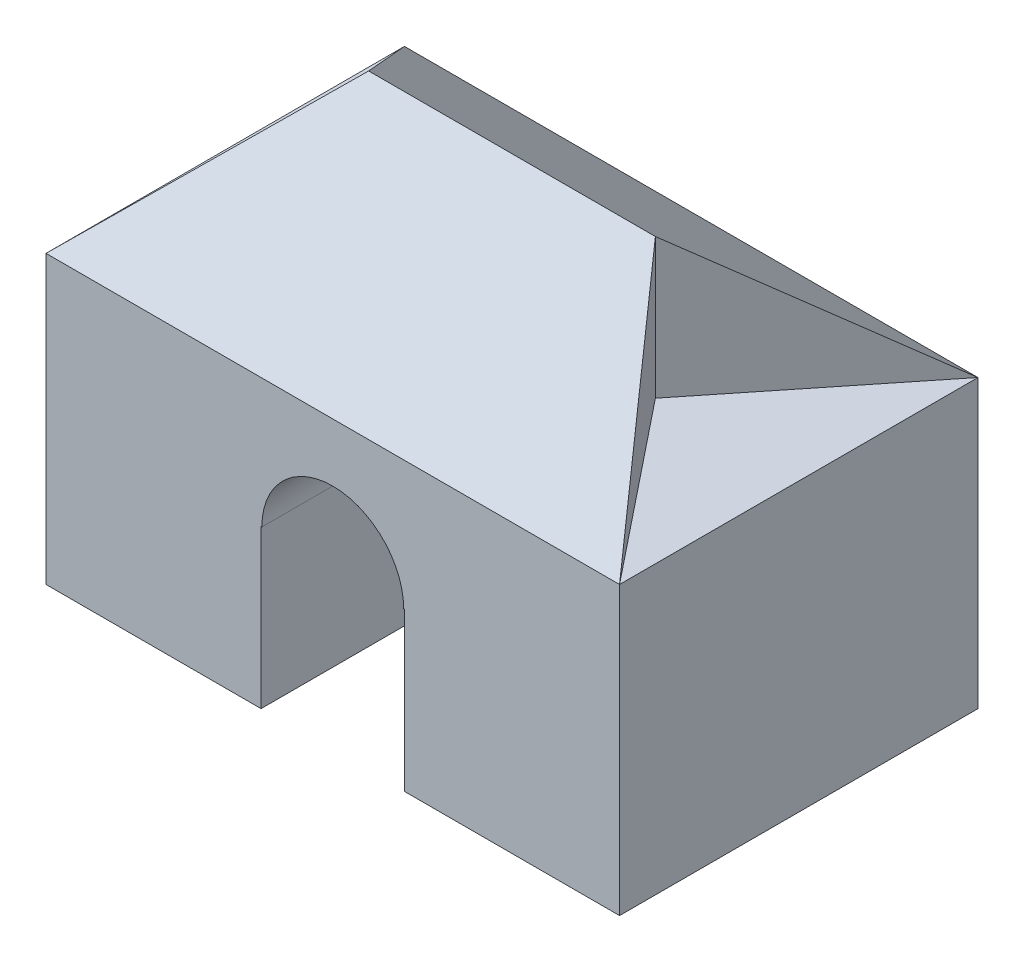
ISO-10303-21;
HEADER;
FILE_DESCRIPTION(('STEP AP214'),'2;1');
FILE_NAME('part.step','',(''),(''),'','','');
FILE_SCHEMA(('AUTOMOTIVE_DESIGN { 1 0 10303 214 1 1 1 1 }'));
ENDSEC;
DATA;
#1=APPLICATION_CONTEXT('core data for automotive mechanical design processes');
#2=APPLICATION_PROTOCOL_DEFINITION('international standard','automotive_design',2000,#1);
#3=PRODUCT_CONTEXT('',#1,'mechanical');
#4=PRODUCT('Part','Part','',(#3));
#5=PRODUCT_RELATED_PRODUCT_CATEGORY('part','',(#4));
#6=PRODUCT_DEFINITION_FORMATION('','',#4);
#7=PRODUCT_DEFINITION_CONTEXT('part definition',#1,'design');
#8=PRODUCT_DEFINITION('design','',#6,#7);
#9=PRODUCT_DEFINITION_SHAPE('','',#8);
#10=(LENGTH_UNIT() NAMED_UNIT(*) SI_UNIT(.MILLI.,.METRE.));
#11=(NAMED_UNIT(*) PLANE_ANGLE_UNIT() SI_UNIT($,.RADIAN.));
#12=(NAMED_UNIT(*) SI_UNIT($,.STERADIAN.) SOLID_ANGLE_UNIT());
#13=UNCERTAINTY_MEASURE_WITH_UNIT(LENGTH_MEASURE(1.E-05),#10,'distance_accuracy_value','');
#14=(GEOMETRIC_REPRESENTATION_CONTEXT(3) GLOBAL_UNCERTAINTY_ASSIGNED_CONTEXT((#13)) GLOBAL_UNIT_ASSIGNED_CONTEXT((#10,
#11,#12)) REPRESENTATION_CONTEXT('',''));
#15=CARTESIAN_POINT('',(0.,0.,0.));
#16=DIRECTION('',(0.,0.,1.));
#17=DIRECTION('',(1.,0.,0.));
#18=AXIS2_PLACEMENT_3D('',#15,#16,#17);
#19=CARTESIAN_POINT('',(0.,200.,0.));
#20=DIRECTION('',(0.,1.,0.));
#21=DIRECTION('',(0.,0.,1.));
#22=AXIS2_PLACEMENT_3D('',#19,#20,#21);
#23=PLANE('',#22);
#24=DIRECTION('',(0.,0.,-1.));
#25=VECTOR('',#24,1.);
#26=CARTESIAN_POINT('',(200.,200.,-125.));
#27=LINE('',#26,#25);
#28=CARTESIAN_POINT('',(200.,200.,125.));
#29=VERTEX_POINT('',#28);
#30=CARTESIAN_POINT('',(200.,200.,-125.));
#31=VERTEX_POINT('',#30);
#32=EDGE_CURVE('E156',#29,#31,#27,.T.);
#33=ORIENTED_EDGE('',*,*,#32,.T.);
#34=DIRECTION('',(-0.624695047554424,0.,0.78086880944303));
#35=VECTOR('',#34,1.);
#36=CARTESIAN_POINT('',(60.9756097560976,200.,48.7804878048781));
#37=LINE('',#36,#35);
#38=CARTESIAN_POINT('',(100.,200.,0.));
#39=VERTEX_POINT('',#38);
#40=EDGE_CURVE('E179',#31,#39,#37,.T.);
#41=ORIENTED_EDGE('',*,*,#40,.T.);
#42=DIRECTION('',(-0.624695047554424,0.,-0.78086880944303));
#43=VECTOR('',#42,1.);
#44=CARTESIAN_POINT('',(60.9756097560976,200.,-48.7804878048781));
#45=LINE('',#44,#43);
#46=EDGE_CURVE('E146',#29,#39,#45,.T.);
#47=ORIENTED_EDGE('',*,*,#46,.F.);
#48=EDGE_LOOP('',(#33,#41,#47));
#49=FACE_BOUND('',#48,.T.);
#50=ADVANCED_FACE('F33',(#49),#23,.T.);
#51=CARTESIAN_POINT('',(200.,200.,-125.));
#52=DIRECTION('',(-1.,0.,0.));
#53=DIRECTION('',(0.,0.,1.));
#54=AXIS2_PLACEMENT_3D('',#51,#52,#53);
#55=PLANE('',#54);
#56=DIRECTION('',(0.,0.,-1.));
#57=VECTOR('',#56,1.);
#58=CARTESIAN_POINT('',(200.,0.,-125.));
#59=LINE('',#58,#57);
#60=CARTESIAN_POINT('',(200.,0.,125.));
#61=VERTEX_POINT('',#60);
#62=CARTESIAN_POINT('',(200.,0.,-125.));
#63=VERTEX_POINT('',#62);
#64=EDGE_CURVE('E192',#61,#63,#59,.T.);
#65=ORIENTED_EDGE('',*,*,#64,.T.);
#66=DIRECTION('',(0.,-1.,0.));
#67=VECTOR('',#66,1.);
#68=CARTESIAN_POINT('',(200.,200.,-125.));
#69=LINE('',#68,#67);
#70=EDGE_CURVE('E174',#31,#63,#69,.T.);
#71=ORIENTED_EDGE('',*,*,#70,.F.);
#72=ORIENTED_EDGE('',*,*,#32,.F.);
#73=DIRECTION('',(0.,-1.,0.));
#74=VECTOR('',#73,1.);
#75=CARTESIAN_POINT('',(200.,200.,125.));
#76=LINE('',#75,#74);
#77=EDGE_CURVE('E131',#29,#61,#76,.T.);
#78=ORIENTED_EDGE('',*,*,#77,.T.);
#79=EDGE_LOOP('',(#65,#71,#72,#78));
#80=FACE_BOUND('',#79,.T.);
#81=ADVANCED_FACE('F190',(#80),#55,.F.);
#82=CARTESIAN_POINT('',(-200.,200.,-125.));
#83=DIRECTION('',(0.,0.,1.));
#84=DIRECTION('',(1.,0.,0.));
#85=AXIS2_PLACEMENT_3D('',#82,#83,#84);
#86=PLANE('',#85);
#87=DIRECTION('',(0.,-1.,0.));
#88=VECTOR('',#87,1.);
#89=CARTESIAN_POINT('',(-200.,200.,-125.));
#90=LINE('',#89,#88);
#91=CARTESIAN_POINT('',(-200.,200.,-125.));
#92=VERTEX_POINT('',#91);
#93=CARTESIAN_POINT('',(-200.,0.,-125.));
#94=VERTEX_POINT('',#93);
#95=EDGE_CURVE('E161',#92,#94,#90,.T.);
#96=ORIENTED_EDGE('',*,*,#95,.F.);
#97=DIRECTION('',(1.,0.,0.));
#98=VECTOR('',#97,1.);
#99=CARTESIAN_POINT('',(200.,200.,-125.));
#100=LINE('',#99,#98);
#101=EDGE_CURVE('E41',#92,#31,#100,.T.);
#102=ORIENTED_EDGE('',*,*,#101,.T.);
#103=ORIENTED_EDGE('',*,*,#70,.T.);
#104=DIRECTION('',(-1.,0.,0.));
#105=VECTOR('',#104,1.);
#106=CARTESIAN_POINT('',(-200.,0.,-125.));
#107=LINE('',#106,#105);
#108=EDGE_CURVE('E200',#63,#94,#107,.T.);
#109=ORIENTED_EDGE('',*,*,#108,.T.);
#110=EDGE_LOOP('',(#96,#102,#103,#109));
#111=FACE_BOUND('',#110,.T.);
#112=ADVANCED_FACE('F172',(#111),#86,.F.);
#113=CARTESIAN_POINT('',(-200.,200.,-125.));
#114=DIRECTION('',(1.,0.,0.));
#115=DIRECTION('',(0.,0.,-1.));
#116=AXIS2_PLACEMENT_3D('',#113,#114,#115);
#117=PLANE('',#116);
#118=DIRECTION('',(0.,0.,1.));
#119=VECTOR('',#118,1.);
#120=CARTESIAN_POINT('',(-200.,0.,-125.));
#121=LINE('',#120,#119);
#122=CARTESIAN_POINT('',(-200.,0.,125.));
#123=VERTEX_POINT('',#122);
#124=EDGE_CURVE('E160',#94,#123,#121,.T.);
#125=ORIENTED_EDGE('',*,*,#124,.T.);
#126=DIRECTION('',(0.,-1.,0.));
#127=VECTOR('',#126,1.);
#128=CARTESIAN_POINT('',(-200.,200.,125.));
#129=LINE('',#128,#127);
#130=CARTESIAN_POINT('',(-200.,200.,125.));
#131=VERTEX_POINT('',#130);
#132=EDGE_CURVE('E128',#131,#123,#129,.T.);
#133=ORIENTED_EDGE('',*,*,#132,.F.);
#134=DIRECTION('',(0.,0.,1.));
#135=VECTOR('',#134,1.);
#136=CARTESIAN_POINT('',(-200.,200.,-125.));
#137=LINE('',#136,#135);
#138=EDGE_CURVE('E150',#92,#131,#137,.T.);
#139=ORIENTED_EDGE('',*,*,#138,.F.);
#140=ORIENTED_EDGE('',*,*,#95,.T.);
#141=EDGE_LOOP('',(#125,#133,#139,#140));
#142=FACE_BOUND('',#141,.T.);
#143=ADVANCED_FACE('F158',(#142),#117,.F.);
#144=CARTESIAN_POINT('',(-200.,200.,125.));
#145=DIRECTION('',(0.,0.,-1.));
#146=DIRECTION('',(-1.,0.,0.));
#147=AXIS2_PLACEMENT_3D('',#144,#145,#146);
#148=PLANE('',#147);
#149=ORIENTED_EDGE('',*,*,#77,.F.);
#150=DIRECTION('',(-1.,0.,0.));
#151=VECTOR('',#150,1.);
#152=CARTESIAN_POINT('',(-200.,200.,125.));
#153=LINE('',#152,#151);
#154=EDGE_CURVE('E123',#29,#131,#153,.T.);
#155=ORIENTED_EDGE('',*,*,#154,.T.);
#156=ORIENTED_EDGE('',*,*,#132,.T.);
#157=DIRECTION('',(1.,0.,0.));
#158=VECTOR('',#157,1.);
#159=CARTESIAN_POINT('',(-200.,0.,125.));
#160=LINE('',#159,#158);
#161=CARTESIAN_POINT('',(-50.,0.,125.));
#162=VERTEX_POINT('',#161);
#163=EDGE_CURVE('E188',#123,#162,#160,.T.);
#164=ORIENTED_EDGE('',*,*,#163,.T.);
#165=DIRECTION('',(0.,-1.,0.));
#166=VECTOR('',#165,1.);
#167=CARTESIAN_POINT('',(-50.,0.,125.));
#168=LINE('',#167,#166);
#169=CARTESIAN_POINT('',(-50.,109.989754523702,125.));
#170=VERTEX_POINT('',#169);
#171=EDGE_CURVE('E221',#170,#162,#168,.T.);
#172=ORIENTED_EDGE('',*,*,#171,.F.);
#173=DIRECTION('',(-1.,0.,0.));
#174=VECTOR('',#173,1.);
#175=CARTESIAN_POINT('',(-50.,109.989754523702,125.));
#176=LINE('',#175,#174);
#177=CARTESIAN_POINT('',(-49.4648033010553,109.989754523702,125.));
#178=VERTEX_POINT('',#177);
#179=EDGE_CURVE('E223',#178,#170,#176,.T.);
#180=ORIENTED_EDGE('',*,*,#179,.F.);
#181=CARTESIAN_POINT('',(0.,109.989754523702,125.));
#182=DIRECTION('',(0.,0.,1.));
#183=DIRECTION('',(1.,0.,0.));
#184=AXIS2_PLACEMENT_3D('',#181,#182,#183);
#185=CIRCLE('',#184,49.4648033010553);
#186=CARTESIAN_POINT('',(49.4648033010553,109.989754523702,125.));
#187=VERTEX_POINT('',#186);
#188=EDGE_CURVE('E226',#187,#178,#185,.T.);
#189=ORIENTED_EDGE('',*,*,#188,.F.);
#190=DIRECTION('',(-1.,0.,0.));
#191=VECTOR('',#190,1.);
#192=CARTESIAN_POINT('',(49.4648033010553,109.989754523702,125.));
#193=LINE('',#192,#191);
#194=CARTESIAN_POINT('',(50.,109.989754523702,125.));
#195=VERTEX_POINT('',#194);
#196=EDGE_CURVE('E229',#195,#187,#193,.T.);
#197=ORIENTED_EDGE('',*,*,#196,.F.);
#198=DIRECTION('',(0.,1.,0.));
#199=VECTOR('',#198,1.);
#200=CARTESIAN_POINT('',(50.,0.,125.));
#201=LINE('',#200,#199);
#202=CARTESIAN_POINT('',(50.,0.,125.));
#203=VERTEX_POINT('',#202);
#204=EDGE_CURVE('E217',#203,#195,#201,.T.);
#205=ORIENTED_EDGE('',*,*,#204,.F.);
#206=EDGE_CURVE('E198',#203,#61,#160,.T.);
#207=ORIENTED_EDGE('',*,*,#206,.T.);
#208=EDGE_LOOP('',(#149,#155,#156,#164,#172,#180,#189,#197,#205,#207));
#209=FACE_BOUND('',#208,.T.);
#210=ADVANCED_FACE('F125',(#209),#148,.F.);
#211=DIRECTION('',(0.624695047554424,0.,0.78086880944303));
#212=VECTOR('',#211,1.);
#213=CARTESIAN_POINT('',(-60.9756097560976,200.,48.7804878048781));
#214=LINE('',#213,#212);
#215=CARTESIAN_POINT('',(-100.,200.,0.));
#216=VERTEX_POINT('',#215);
#217=EDGE_CURVE('E147',#92,#216,#214,.T.);
#218=ORIENTED_EDGE('',*,*,#217,.F.);
#219=ORIENTED_EDGE('',*,*,#138,.T.);
#220=DIRECTION('',(0.624695047554424,0.,-0.78086880944303));
#221=VECTOR('',#220,1.);
#222=CARTESIAN_POINT('',(-60.9756097560976,200.,-48.7804878048781));
#223=LINE('',#222,#221);
#224=EDGE_CURVE('E138',#131,#216,#223,.T.);
#225=ORIENTED_EDGE('',*,*,#224,.T.);
#226=EDGE_LOOP('',(#218,#219,#225));
#227=FACE_BOUND('',#226,.T.);
#228=ADVANCED_FACE('F151',(#227),#23,.T.);
#229=CARTESIAN_POINT('',(0.,0.,0.));
#230=DIRECTION('',(0.,1.,0.));
#231=DIRECTION('',(0.,0.,1.));
#232=AXIS2_PLACEMENT_3D('',#229,#230,#231);
#233=PLANE('',#232);
#234=ORIENTED_EDGE('',*,*,#206,.F.);
#235=DIRECTION('',(0.,0.,1.));
#236=VECTOR('',#235,1.);
#237=CARTESIAN_POINT('',(50.,0.,9.99999999999999));
#238=LINE('',#237,#236);
#239=CARTESIAN_POINT('',(50.,0.,9.99999999999999));
#240=VERTEX_POINT('',#239);
#241=EDGE_CURVE('E214',#240,#203,#238,.T.);
#242=ORIENTED_EDGE('',*,*,#241,.F.);
#243=DIRECTION('',(1.,0.,0.));
#244=VECTOR('',#243,1.);
#245=CARTESIAN_POINT('',(-50.,0.,9.99999999999999));
#246=LINE('',#245,#244);
#247=CARTESIAN_POINT('',(-50.,0.,9.99999999999999));
#248=VERTEX_POINT('',#247);
#249=EDGE_CURVE('E234',#248,#240,#246,.T.);
#250=ORIENTED_EDGE('',*,*,#249,.F.);
#251=DIRECTION('',(0.,0.,1.));
#252=VECTOR('',#251,1.);
#253=CARTESIAN_POINT('',(-50.,0.,9.99999999999999));
#254=LINE('',#253,#252);
#255=EDGE_CURVE('E211',#248,#162,#254,.T.);
#256=ORIENTED_EDGE('',*,*,#255,.T.);
#257=ORIENTED_EDGE('',*,*,#163,.F.);
#258=ORIENTED_EDGE('',*,*,#124,.F.);
#259=ORIENTED_EDGE('',*,*,#108,.F.);
#260=ORIENTED_EDGE('',*,*,#64,.F.);
#261=EDGE_LOOP('',(#234,#242,#250,#256,#257,#258,#259,#260));
#262=FACE_BOUND('',#261,.T.);
#263=ADVANCED_FACE('F264',(#262),#233,.F.);
#264=CARTESIAN_POINT('',(49.4648033010553,109.989754523702,9.99999999999999));
#265=DIRECTION('',(0.,1.,0.));
#266=DIRECTION('',(0.,0.,1.));
#267=AXIS2_PLACEMENT_3D('',#264,#265,#266);
#268=PLANE('',#267);
#269=ORIENTED_EDGE('',*,*,#196,.T.);
#270=DIRECTION('',(0.,0.,1.));
#271=VECTOR('',#270,1.);
#272=CARTESIAN_POINT('',(49.4648033010553,109.989754523702,9.99999999999999));
#273=LINE('',#272,#271);
#274=CARTESIAN_POINT('',(49.4648033010553,109.989754523702,9.99999999999999));
#275=VERTEX_POINT('',#274);
#276=EDGE_CURVE('E204',#275,#187,#273,.T.);
#277=ORIENTED_EDGE('',*,*,#276,.F.);
#278=DIRECTION('',(-1.,0.,0.));
#279=VECTOR('',#278,1.);
#280=CARTESIAN_POINT('',(49.4648033010553,109.989754523702,9.99999999999999));
#281=LINE('',#280,#279);
#282=CARTESIAN_POINT('',(50.,109.989754523702,9.99999999999999));
#283=VERTEX_POINT('',#282);
#284=EDGE_CURVE('E220',#283,#275,#281,.T.);
#285=ORIENTED_EDGE('',*,*,#284,.F.);
#286=DIRECTION('',(0.,0.,1.));
#287=VECTOR('',#286,1.);
#288=CARTESIAN_POINT('',(50.,109.989754523702,9.99999999999999));
#289=LINE('',#288,#287);
#290=EDGE_CURVE('E202',#283,#195,#289,.T.);
#291=ORIENTED_EDGE('',*,*,#290,.T.);
#292=EDGE_LOOP('',(#269,#277,#285,#291));
#293=FACE_BOUND('',#292,.T.);
#294=ADVANCED_FACE('F269',(#293),#268,.F.);
#295=CARTESIAN_POINT('',(50.,0.,9.99999999999999));
#296=DIRECTION('',(1.,0.,0.));
#297=DIRECTION('',(0.,0.,-1.));
#298=AXIS2_PLACEMENT_3D('',#295,#296,#297);
#299=PLANE('',#298);
#300=ORIENTED_EDGE('',*,*,#204,.T.);
#301=ORIENTED_EDGE('',*,*,#290,.F.);
#302=DIRECTION('',(0.,1.,0.));
#303=VECTOR('',#302,1.);
#304=CARTESIAN_POINT('',(50.,0.,9.99999999999999));
#305=LINE('',#304,#303);
#306=EDGE_CURVE('E207',#240,#283,#305,.T.);
#307=ORIENTED_EDGE('',*,*,#306,.F.);
#308=ORIENTED_EDGE('',*,*,#241,.T.);
#309=EDGE_LOOP('',(#300,#301,#307,#308));
#310=FACE_BOUND('',#309,.T.);
#311=ADVANCED_FACE('F348',(#310),#299,.F.);
#312=CARTESIAN_POINT('',(-50.,0.,9.99999999999999));
#313=DIRECTION('',(-1.,0.,0.));
#314=DIRECTION('',(0.,0.,1.));
#315=AXIS2_PLACEMENT_3D('',#312,#313,#314);
#316=PLANE('',#315);
#317=ORIENTED_EDGE('',*,*,#171,.T.);
#318=ORIENTED_EDGE('',*,*,#255,.F.);
#319=DIRECTION('',(0.,-1.,0.));
#320=VECTOR('',#319,1.);
#321=CARTESIAN_POINT('',(-50.,0.,9.99999999999999));
#322=LINE('',#321,#320);
#323=CARTESIAN_POINT('',(-50.,109.989754523702,9.99999999999999));
#324=VERTEX_POINT('',#323);
#325=EDGE_CURVE('E236',#324,#248,#322,.T.);
#326=ORIENTED_EDGE('',*,*,#325,.F.);
#327=DIRECTION('',(0.,0.,1.));
#328=VECTOR('',#327,1.);
#329=CARTESIAN_POINT('',(-50.,109.989754523702,9.99999999999999));
#330=LINE('',#329,#328);
#331=EDGE_CURVE('E209',#324,#170,#330,.T.);
#332=ORIENTED_EDGE('',*,*,#331,.T.);
#333=EDGE_LOOP('',(#317,#318,#326,#332));
#334=FACE_BOUND('',#333,.T.);
#335=ADVANCED_FACE('F351',(#334),#316,.F.);
#336=CARTESIAN_POINT('',(-50.,109.989754523702,9.99999999999999));
#337=DIRECTION('',(0.,1.,0.));
#338=DIRECTION('',(0.,0.,1.));
#339=AXIS2_PLACEMENT_3D('',#336,#337,#338);
#340=PLANE('',#339);
#341=ORIENTED_EDGE('',*,*,#179,.T.);
#342=ORIENTED_EDGE('',*,*,#331,.F.);
#343=DIRECTION('',(-1.,0.,0.));
#344=VECTOR('',#343,1.);
#345=CARTESIAN_POINT('',(-50.,109.989754523702,9.99999999999999));
#346=LINE('',#345,#344);
#347=CARTESIAN_POINT('',(-49.4648033010553,109.989754523702,9.99999999999999));
#348=VERTEX_POINT('',#347);
#349=EDGE_CURVE('E238',#348,#324,#346,.T.);
#350=ORIENTED_EDGE('',*,*,#349,.F.);
#351=DIRECTION('',(0.,0.,1.));
#352=VECTOR('',#351,1.);
#353=CARTESIAN_POINT('',(-49.4648033010553,109.989754523702,9.99999999999999));
#354=LINE('',#353,#352);
#355=EDGE_CURVE('E206',#348,#178,#354,.T.);
#356=ORIENTED_EDGE('',*,*,#355,.T.);
#357=EDGE_LOOP('',(#341,#342,#350,#356));
#358=FACE_BOUND('',#357,.T.);
#359=ADVANCED_FACE('F355',(#358),#340,.F.);
#360=CARTESIAN_POINT('',(0.,109.989754523702,9.99999999999999));
#361=DIRECTION('',(0.,0.,1.));
#362=DIRECTION('',(1.,0.,0.));
#363=AXIS2_PLACEMENT_3D('',#360,#361,#362);
#364=CYLINDRICAL_SURFACE('',#363,49.4648033010553);
#365=ORIENTED_EDGE('',*,*,#188,.T.);
#366=ORIENTED_EDGE('',*,*,#355,.F.);
#367=CARTESIAN_POINT('',(0.,109.989754523702,9.99999999999999));
#368=DIRECTION('',(0.,0.,1.));
#369=DIRECTION('',(1.,0.,0.));
#370=AXIS2_PLACEMENT_3D('',#367,#368,#369);
#371=CIRCLE('',#370,49.4648033010553);
#372=EDGE_CURVE('E241',#275,#348,#371,.T.);
#373=ORIENTED_EDGE('',*,*,#372,.F.);
#374=ORIENTED_EDGE('',*,*,#276,.T.);
#375=EDGE_LOOP('',(#365,#366,#373,#374));
#376=FACE_BOUND('',#375,.T.);
#377=ADVANCED_FACE('F346',(#376),#364,.F.);
#378=CARTESIAN_POINT('',(0.,109.989754523702,9.99999999999999));
#379=DIRECTION('',(0.,0.,1.));
#380=DIRECTION('',(1.,0.,0.));
#381=AXIS2_PLACEMENT_3D('',#378,#379,#380);
#382=PLANE('',#381);
#383=ORIENTED_EDGE('',*,*,#284,.T.);
#384=ORIENTED_EDGE('',*,*,#372,.T.);
#385=ORIENTED_EDGE('',*,*,#349,.T.);
#386=ORIENTED_EDGE('',*,*,#325,.T.);
#387=ORIENTED_EDGE('',*,*,#249,.T.);
#388=ORIENTED_EDGE('',*,*,#306,.T.);
#389=EDGE_LOOP('',(#383,#384,#385,#386,#387,#388));
#390=FACE_BOUND('',#389,.T.);
#391=ADVANCED_FACE('F302',(#390),#382,.T.);
#392=CARTESIAN_POINT('',(-60.9756097560976,300.,48.7804878048781));
#393=DIRECTION('',(0.78086880944303,0.,-0.624695047554424));
#394=DIRECTION('',(-0.624695047554424,0.,-0.78086880944303));
#395=AXIS2_PLACEMENT_3D('',#392,#393,#394);
#396=PLANE('',#395);
#397=DIRECTION('',(0.,-1.,0.));
#398=VECTOR('',#397,1.);
#399=CARTESIAN_POINT('',(-100.,300.,0.));
#400=LINE('',#399,#398);
#401=CARTESIAN_POINT('',(-100.,297.66070331334,0.));
#402=VERTEX_POINT('',#401);
#403=EDGE_CURVE('E142',#402,#216,#400,.T.);
#404=ORIENTED_EDGE('',*,*,#403,.F.);
#405=DIRECTION('',(-0.53328507556557,-0.520809955462401,-0.666606344456963));
#406=VECTOR('',#405,1.);
#407=CARTESIAN_POINT('',(-69.8465874232995,327.108738108716,37.6917657208756));
#408=LINE('',#407,#406);
#409=EDGE_CURVE('E165',#402,#92,#408,.T.);
#410=ORIENTED_EDGE('',*,*,#409,.T.);
#411=ORIENTED_EDGE('',*,*,#217,.T.);
#412=EDGE_LOOP('',(#404,#410,#411));
#413=FACE_BOUND('',#412,.T.);
#414=ADVANCED_FACE('F250',(#413),#396,.F.);
#415=CARTESIAN_POINT('',(-60.9756097560976,300.,-48.7804878048781));
#416=DIRECTION('',(-0.78086880944303,0.,-0.624695047554424));
#417=DIRECTION('',(-0.624695047554424,0.,0.78086880944303));
#418=AXIS2_PLACEMENT_3D('',#415,#416,#417);
#419=PLANE('',#418);
#420=ORIENTED_EDGE('',*,*,#224,.F.);
#421=DIRECTION('',(0.533285075565568,0.520809955462408,-0.66660634445696));
#422=VECTOR('',#421,1.);
#423=CARTESIAN_POINT('',(-70.9109861433712,326.069238832638,-36.361267320786));
#424=LINE('',#423,#422);
#425=EDGE_CURVE('E133',#131,#402,#424,.T.);
#426=ORIENTED_EDGE('',*,*,#425,.T.);
#427=ORIENTED_EDGE('',*,*,#403,.T.);
#428=EDGE_LOOP('',(#420,#426,#427));
#429=FACE_BOUND('',#428,.T.);
#430=ADVANCED_FACE('F140',(#429),#419,.T.);
#431=CARTESIAN_POINT('',(60.9756097560976,300.,-48.7804878048781));
#432=DIRECTION('',(-0.78086880944303,0.,0.624695047554424));
#433=DIRECTION('',(0.624695047554424,0.,0.78086880944303));
#434=AXIS2_PLACEMENT_3D('',#431,#432,#433);
#435=PLANE('',#434);
#436=DIRECTION('',(0.,-1.,0.));
#437=VECTOR('',#436,1.);
#438=CARTESIAN_POINT('',(100.,300.,0.));
#439=LINE('',#438,#437);
#440=CARTESIAN_POINT('',(100.,297.66070331334,0.));
#441=VERTEX_POINT('',#440);
#442=EDGE_CURVE('E182',#441,#39,#439,.T.);
#443=ORIENTED_EDGE('',*,*,#442,.F.);
#444=DIRECTION('',(0.533285075565568,-0.520809955462408,0.66660634445696));
#445=VECTOR('',#444,1.);
#446=CARTESIAN_POINT('',(69.8465874233012,327.108738108717,-37.6917657208736));
#447=LINE('',#446,#445);
#448=EDGE_CURVE('E134',#441,#29,#447,.T.);
#449=ORIENTED_EDGE('',*,*,#448,.T.);
#450=ORIENTED_EDGE('',*,*,#46,.T.);
#451=EDGE_LOOP('',(#443,#449,#450));
#452=FACE_BOUND('',#451,.T.);
#453=ADVANCED_FACE('F313',(#452),#435,.F.);
#454=CARTESIAN_POINT('',(60.9756097560976,300.,48.7804878048781));
#455=DIRECTION('',(0.78086880944303,0.,0.624695047554424));
#456=DIRECTION('',(0.624695047554424,0.,-0.78086880944303));
#457=AXIS2_PLACEMENT_3D('',#454,#455,#456);
#458=PLANE('',#457);
#459=ORIENTED_EDGE('',*,*,#40,.F.);
#460=DIRECTION('',(-0.53328507556557,0.520809955462401,0.666606344456963));
#461=VECTOR('',#460,1.);
#462=CARTESIAN_POINT('',(70.9109861433704,326.069238832637,36.361267320787));
#463=LINE('',#462,#461);
#464=EDGE_CURVE('E11',#31,#441,#463,.T.);
#465=ORIENTED_EDGE('',*,*,#464,.T.);
#466=ORIENTED_EDGE('',*,*,#442,.T.);
#467=EDGE_LOOP('',(#459,#465,#466));
#468=FACE_BOUND('',#467,.T.);
#469=ADVANCED_FACE('F181',(#468),#458,.T.);
#470=CARTESIAN_POINT('',(0.,300.,-2.99416321930795));
#471=DIRECTION('',(0.,0.788010753606722,0.615661475325658));
#472=DIRECTION('',(-1.,0.,0.));
#473=AXIS2_PLACEMENT_3D('',#470,#471,#472);
#474=PLANE('',#473);
#475=ORIENTED_EDGE('',*,*,#448,.F.);
#476=DIRECTION('',(-1.,0.,0.));
#477=VECTOR('',#476,1.);
#478=CARTESIAN_POINT('',(0.,297.660703313339,1.14578485588268E-12));
#479=LINE('',#478,#477);
#480=EDGE_CURVE('E48',#441,#402,#479,.T.);
#481=ORIENTED_EDGE('',*,*,#480,.T.);
#482=ORIENTED_EDGE('',*,*,#425,.F.);
#483=ORIENTED_EDGE('',*,*,#154,.F.);
#484=EDGE_LOOP('',(#475,#481,#482,#483));
#485=FACE_BOUND('',#484,.T.);
#486=ADVANCED_FACE('F163',(#485),#474,.T.);
#487=CARTESIAN_POINT('',(0.,300.,2.9941632193103));
#488=DIRECTION('',(0.,0.788010753606727,-0.615661475325651));
#489=DIRECTION('',(1.,0.,0.));
#490=AXIS2_PLACEMENT_3D('',#487,#488,#489);
#491=PLANE('',#490);
#492=ORIENTED_EDGE('',*,*,#464,.F.);
#493=ORIENTED_EDGE('',*,*,#101,.F.);
#494=ORIENTED_EDGE('',*,*,#409,.F.);
#495=ORIENTED_EDGE('',*,*,#480,.F.);
#496=EDGE_LOOP('',(#492,#493,#494,#495));
#497=FACE_BOUND('',#496,.T.);
#498=ADVANCED_FACE('F35',(#497),#491,.T.);
#499=CLOSED_SHELL('',(#50,#81,#112,#143,#210,#228,#263,#294,#311,#335,#359,#377,#391,#414,#430,
#453,#469,#486,#498));
#500=MANIFOLD_SOLID_BREP('B2',#499);
#501=ADVANCED_BREP_SHAPE_REPRESENTATION('',(#18,#500),#14);
#502=SHAPE_DEFINITION_REPRESENTATION(#9,#501);
ENDSEC;
END-ISO-10303-21;
